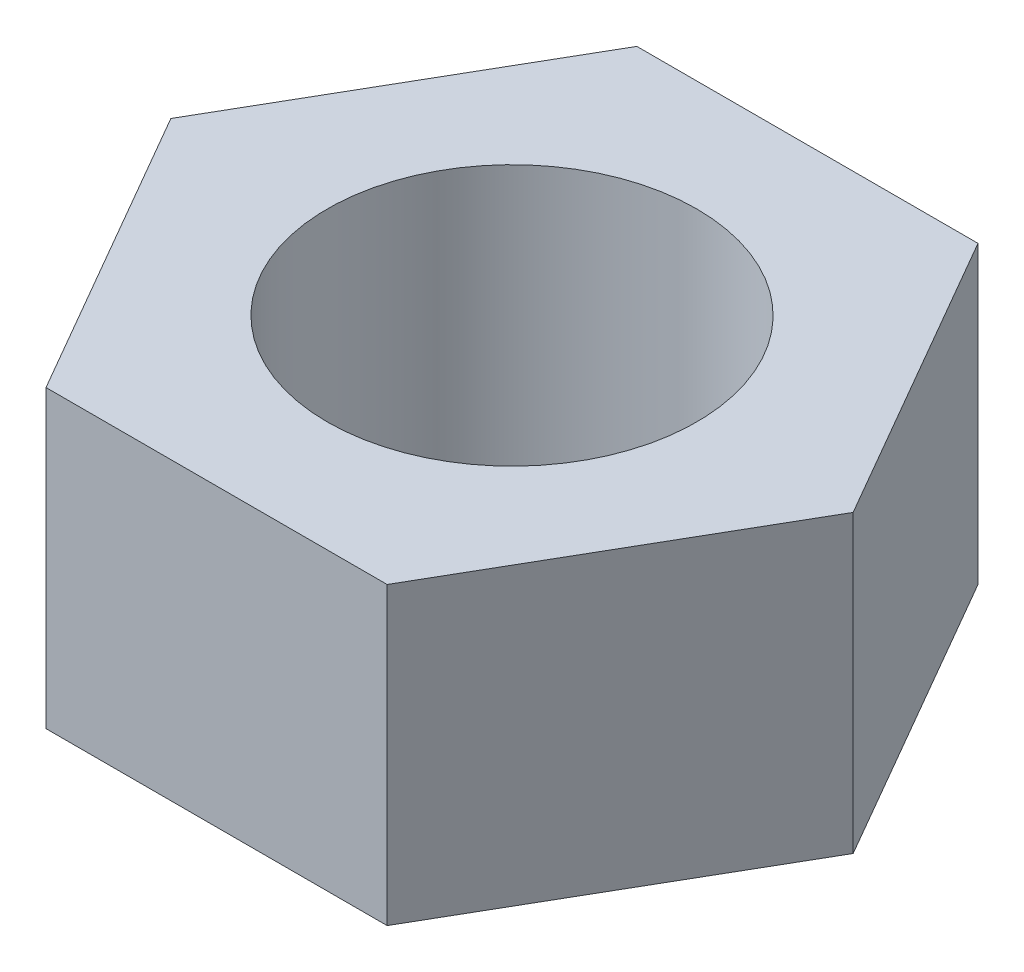
ISO-10303-21;
HEADER;
FILE_DESCRIPTION(('STEP AP214'),'2;1');
FILE_NAME('part.step','',(''),(''),'','','');
FILE_SCHEMA(('AUTOMOTIVE_DESIGN { 1 0 10303 214 1 1 1 1 }'));
ENDSEC;
DATA;
#1=APPLICATION_CONTEXT('core data for automotive mechanical design processes');
#2=APPLICATION_PROTOCOL_DEFINITION('international standard','automotive_design',2000,#1);
#3=PRODUCT_CONTEXT('',#1,'mechanical');
#4=PRODUCT('Part','Part','',(#3));
#5=PRODUCT_RELATED_PRODUCT_CATEGORY('part','',(#4));
#6=PRODUCT_DEFINITION_FORMATION('','',#4);
#7=PRODUCT_DEFINITION_CONTEXT('part definition',#1,'design');
#8=PRODUCT_DEFINITION('design','',#6,#7);
#9=PRODUCT_DEFINITION_SHAPE('','',#8);
#10=(LENGTH_UNIT() NAMED_UNIT(*) SI_UNIT(.MILLI.,.METRE.));
#11=(NAMED_UNIT(*) PLANE_ANGLE_UNIT() SI_UNIT($,.RADIAN.));
#12=(NAMED_UNIT(*) SI_UNIT($,.STERADIAN.) SOLID_ANGLE_UNIT());
#13=UNCERTAINTY_MEASURE_WITH_UNIT(LENGTH_MEASURE(1.E-05),#10,'distance_accuracy_value','');
#14=(GEOMETRIC_REPRESENTATION_CONTEXT(3) GLOBAL_UNCERTAINTY_ASSIGNED_CONTEXT((#13)) GLOBAL_UNIT_ASSIGNED_CONTEXT((#10,
#11,#12)) REPRESENTATION_CONTEXT('',''));
#15=CARTESIAN_POINT('',(0.,0.,0.));
#16=DIRECTION('',(0.,0.,1.));
#17=DIRECTION('',(1.,0.,0.));
#18=AXIS2_PLACEMENT_3D('',#15,#16,#17);
#19=CARTESIAN_POINT('',(0.,4.,0.));
#20=DIRECTION('',(0.,-1.,0.));
#21=DIRECTION('',(0.,0.,-1.));
#22=AXIS2_PLACEMENT_3D('',#19,#20,#21);
#23=PLANE('',#22);
#24=DIRECTION('',(-0.500000000000003,0.,0.866025403784437));
#25=VECTOR('',#24,1.);
#26=CARTESIAN_POINT('',(-2.3094010767585,4.,-4.));
#27=LINE('',#26,#25);
#28=CARTESIAN_POINT('',(-2.3094010767585,4.,-4.));
#29=VERTEX_POINT('',#28);
#30=CARTESIAN_POINT('',(-4.618802153517,4.,0.));
#31=VERTEX_POINT('',#30);
#32=EDGE_CURVE('E150',#29,#31,#27,.T.);
#33=ORIENTED_EDGE('',*,*,#32,.T.);
#34=DIRECTION('',(0.499999999999996,0.,0.866025403784441));
#35=VECTOR('',#34,1.);
#36=CARTESIAN_POINT('',(-2.3094010767585,4.,4.));
#37=LINE('',#36,#35);
#38=CARTESIAN_POINT('',(-2.3094010767585,4.,4.));
#39=VERTEX_POINT('',#38);
#40=EDGE_CURVE('E98',#31,#39,#37,.T.);
#41=ORIENTED_EDGE('',*,*,#40,.T.);
#42=DIRECTION('',(1.,0.,0.));
#43=VECTOR('',#42,1.);
#44=CARTESIAN_POINT('',(-2.3094010767585,4.,4.));
#45=LINE('',#44,#43);
#46=CARTESIAN_POINT('',(2.30940107675851,4.,4.));
#47=VERTEX_POINT('',#46);
#48=EDGE_CURVE('E111',#39,#47,#45,.T.);
#49=ORIENTED_EDGE('',*,*,#48,.T.);
#50=DIRECTION('',(0.500000000000001,0.,-0.866025403784438));
#51=VECTOR('',#50,1.);
#52=CARTESIAN_POINT('',(4.61880215351701,4.,0.));
#53=LINE('',#52,#51);
#54=CARTESIAN_POINT('',(4.61880215351701,4.,0.));
#55=VERTEX_POINT('',#54);
#56=EDGE_CURVE('E105',#47,#55,#53,.T.);
#57=ORIENTED_EDGE('',*,*,#56,.T.);
#58=DIRECTION('',(-0.500000000000001,0.,-0.866025403784438));
#59=VECTOR('',#58,1.);
#60=CARTESIAN_POINT('',(4.61880215351701,4.,0.));
#61=LINE('',#60,#59);
#62=CARTESIAN_POINT('',(2.30940107675851,4.,-4.));
#63=VERTEX_POINT('',#62);
#64=EDGE_CURVE('E109',#55,#63,#61,.T.);
#65=ORIENTED_EDGE('',*,*,#64,.T.);
#66=DIRECTION('',(-1.,0.,0.));
#67=VECTOR('',#66,1.);
#68=CARTESIAN_POINT('',(-2.3094010767585,4.,-4.));
#69=LINE('',#68,#67);
#70=EDGE_CURVE('E61',#63,#29,#69,.T.);
#71=ORIENTED_EDGE('',*,*,#70,.T.);
#72=EDGE_LOOP('',(#33,#41,#49,#57,#65,#71));
#73=FACE_BOUND('',#72,.T.);
#74=CARTESIAN_POINT('',(0.,4.,0.));
#75=DIRECTION('',(0.,1.,0.));
#76=DIRECTION('',(0.,0.,1.));
#77=AXIS2_PLACEMENT_3D('',#74,#75,#76);
#78=CIRCLE('',#77,2.5);
#79=CARTESIAN_POINT('',(0.,4.,2.50000000000001));
#80=VERTEX_POINT('',#79);
#81=EDGE_CURVE('E138',#80,#80,#78,.T.);
#82=ORIENTED_EDGE('',*,*,#81,.F.);
#83=EDGE_LOOP('',(#82));
#84=FACE_BOUND('',#83,.T.);
#85=ADVANCED_FACE('F43',(#73,#84),#23,.F.);
#86=CARTESIAN_POINT('',(0.,0.,0.));
#87=DIRECTION('',(0.,-1.,0.));
#88=DIRECTION('',(0.,0.,-1.));
#89=AXIS2_PLACEMENT_3D('',#86,#87,#88);
#90=PLANE('',#89);
#91=DIRECTION('',(-0.500000000000003,0.,0.866025403784437));
#92=VECTOR('',#91,1.);
#93=CARTESIAN_POINT('',(-2.3094010767585,0.,-4.));
#94=LINE('',#93,#92);
#95=CARTESIAN_POINT('',(-2.3094010767585,0.,-4.));
#96=VERTEX_POINT('',#95);
#97=CARTESIAN_POINT('',(-4.618802153517,0.,0.));
#98=VERTEX_POINT('',#97);
#99=EDGE_CURVE('E133',#96,#98,#94,.T.);
#100=ORIENTED_EDGE('',*,*,#99,.F.);
#101=DIRECTION('',(-1.,0.,0.));
#102=VECTOR('',#101,1.);
#103=CARTESIAN_POINT('',(-2.3094010767585,0.,-4.));
#104=LINE('',#103,#102);
#105=CARTESIAN_POINT('',(2.30940107675851,0.,-4.));
#106=VERTEX_POINT('',#105);
#107=EDGE_CURVE('E90',#106,#96,#104,.T.);
#108=ORIENTED_EDGE('',*,*,#107,.F.);
#109=DIRECTION('',(-0.500000000000001,0.,-0.866025403784438));
#110=VECTOR('',#109,1.);
#111=CARTESIAN_POINT('',(4.61880215351701,0.,0.));
#112=LINE('',#111,#110);
#113=CARTESIAN_POINT('',(4.61880215351701,0.,0.));
#114=VERTEX_POINT('',#113);
#115=EDGE_CURVE('E84',#114,#106,#112,.T.);
#116=ORIENTED_EDGE('',*,*,#115,.F.);
#117=DIRECTION('',(0.500000000000001,0.,-0.866025403784438));
#118=VECTOR('',#117,1.);
#119=CARTESIAN_POINT('',(4.61880215351701,0.,0.));
#120=LINE('',#119,#118);
#121=CARTESIAN_POINT('',(2.30940107675851,0.,4.));
#122=VERTEX_POINT('',#121);
#123=EDGE_CURVE('E120',#122,#114,#120,.T.);
#124=ORIENTED_EDGE('',*,*,#123,.F.);
#125=DIRECTION('',(1.,0.,0.));
#126=VECTOR('',#125,1.);
#127=CARTESIAN_POINT('',(-2.3094010767585,0.,4.));
#128=LINE('',#127,#126);
#129=CARTESIAN_POINT('',(-2.3094010767585,0.,4.));
#130=VERTEX_POINT('',#129);
#131=EDGE_CURVE('E141',#130,#122,#128,.T.);
#132=ORIENTED_EDGE('',*,*,#131,.F.);
#133=DIRECTION('',(0.499999999999996,0.,0.866025403784441));
#134=VECTOR('',#133,1.);
#135=CARTESIAN_POINT('',(-2.3094010767585,0.,4.));
#136=LINE('',#135,#134);
#137=EDGE_CURVE('E137',#98,#130,#136,.T.);
#138=ORIENTED_EDGE('',*,*,#137,.F.);
#139=EDGE_LOOP('',(#100,#108,#116,#124,#132,#138));
#140=FACE_BOUND('',#139,.T.);
#141=CARTESIAN_POINT('',(0.,0.,0.));
#142=DIRECTION('',(0.,1.,0.));
#143=DIRECTION('',(0.,0.,1.));
#144=AXIS2_PLACEMENT_3D('',#141,#142,#143);
#145=CIRCLE('',#144,2.5);
#146=CARTESIAN_POINT('',(0.,0.,2.50000000000001));
#147=VERTEX_POINT('',#146);
#148=EDGE_CURVE('E265',#147,#147,#145,.T.);
#149=ORIENTED_EDGE('',*,*,#148,.T.);
#150=EDGE_LOOP('',(#149));
#151=FACE_BOUND('',#150,.T.);
#152=ADVANCED_FACE('F163',(#140,#151),#90,.T.);
#153=CARTESIAN_POINT('',(-2.3094010767585,4.,-4.));
#154=DIRECTION('',(0.866025403784437,0.,0.500000000000003));
#155=DIRECTION('',(0.500000000000003,0.,-0.866025403784437));
#156=AXIS2_PLACEMENT_3D('',#153,#154,#155);
#157=PLANE('',#156);
#158=ORIENTED_EDGE('',*,*,#99,.T.);
#159=DIRECTION('',(0.,-1.,0.));
#160=VECTOR('',#159,1.);
#161=CARTESIAN_POINT('',(-4.618802153517,4.,0.));
#162=LINE('',#161,#160);
#163=EDGE_CURVE('E11',#31,#98,#162,.T.);
#164=ORIENTED_EDGE('',*,*,#163,.F.);
#165=ORIENTED_EDGE('',*,*,#32,.F.);
#166=DIRECTION('',(0.,-1.,0.));
#167=VECTOR('',#166,1.);
#168=CARTESIAN_POINT('',(-2.3094010767585,4.,-4.));
#169=LINE('',#168,#167);
#170=EDGE_CURVE('E129',#29,#96,#169,.T.);
#171=ORIENTED_EDGE('',*,*,#170,.T.);
#172=EDGE_LOOP('',(#158,#164,#165,#171));
#173=FACE_BOUND('',#172,.T.);
#174=ADVANCED_FACE('F45',(#173),#157,.F.);
#175=CARTESIAN_POINT('',(-2.3094010767585,4.,4.));
#176=DIRECTION('',(0.866025403784441,0.,-0.499999999999996));
#177=DIRECTION('',(-0.499999999999996,0.,-0.866025403784441));
#178=AXIS2_PLACEMENT_3D('',#175,#176,#177);
#179=PLANE('',#178);
#180=ORIENTED_EDGE('',*,*,#137,.T.);
#181=DIRECTION('',(0.,-1.,0.));
#182=VECTOR('',#181,1.);
#183=CARTESIAN_POINT('',(-2.3094010767585,4.,4.));
#184=LINE('',#183,#182);
#185=EDGE_CURVE('E53',#39,#130,#184,.T.);
#186=ORIENTED_EDGE('',*,*,#185,.F.);
#187=ORIENTED_EDGE('',*,*,#40,.F.);
#188=ORIENTED_EDGE('',*,*,#163,.T.);
#189=EDGE_LOOP('',(#180,#186,#187,#188));
#190=FACE_BOUND('',#189,.T.);
#191=ADVANCED_FACE('F188',(#190),#179,.F.);
#192=CARTESIAN_POINT('',(-2.3094010767585,4.,4.));
#193=DIRECTION('',(0.,0.,-1.));
#194=DIRECTION('',(-1.,0.,0.));
#195=AXIS2_PLACEMENT_3D('',#192,#193,#194);
#196=PLANE('',#195);
#197=ORIENTED_EDGE('',*,*,#131,.T.);
#198=DIRECTION('',(0.,-1.,0.));
#199=VECTOR('',#198,1.);
#200=CARTESIAN_POINT('',(2.30940107675851,4.,4.));
#201=LINE('',#200,#199);
#202=EDGE_CURVE('E122',#47,#122,#201,.T.);
#203=ORIENTED_EDGE('',*,*,#202,.F.);
#204=ORIENTED_EDGE('',*,*,#48,.F.);
#205=ORIENTED_EDGE('',*,*,#185,.T.);
#206=EDGE_LOOP('',(#197,#203,#204,#205));
#207=FACE_BOUND('',#206,.T.);
#208=ADVANCED_FACE('F160',(#207),#196,.F.);
#209=CARTESIAN_POINT('',(4.61880215351701,4.,0.));
#210=DIRECTION('',(-0.866025403784438,0.,-0.500000000000001));
#211=DIRECTION('',(-0.500000000000001,0.,0.866025403784438));
#212=AXIS2_PLACEMENT_3D('',#209,#210,#211);
#213=PLANE('',#212);
#214=ORIENTED_EDGE('',*,*,#123,.T.);
#215=DIRECTION('',(0.,-1.,0.));
#216=VECTOR('',#215,1.);
#217=CARTESIAN_POINT('',(4.61880215351701,4.,0.));
#218=LINE('',#217,#216);
#219=EDGE_CURVE('E117',#55,#114,#218,.T.);
#220=ORIENTED_EDGE('',*,*,#219,.F.);
#221=ORIENTED_EDGE('',*,*,#56,.F.);
#222=ORIENTED_EDGE('',*,*,#202,.T.);
#223=EDGE_LOOP('',(#214,#220,#221,#222));
#224=FACE_BOUND('',#223,.T.);
#225=ADVANCED_FACE('F118',(#224),#213,.F.);
#226=CARTESIAN_POINT('',(4.61880215351701,4.,0.));
#227=DIRECTION('',(-0.866025403784438,0.,0.500000000000001));
#228=DIRECTION('',(0.500000000000001,0.,0.866025403784438));
#229=AXIS2_PLACEMENT_3D('',#226,#227,#228);
#230=PLANE('',#229);
#231=ORIENTED_EDGE('',*,*,#115,.T.);
#232=DIRECTION('',(0.,-1.,0.));
#233=VECTOR('',#232,1.);
#234=CARTESIAN_POINT('',(2.30940107675851,4.,-4.));
#235=LINE('',#234,#233);
#236=EDGE_CURVE('E123',#63,#106,#235,.T.);
#237=ORIENTED_EDGE('',*,*,#236,.F.);
#238=ORIENTED_EDGE('',*,*,#64,.F.);
#239=ORIENTED_EDGE('',*,*,#219,.T.);
#240=EDGE_LOOP('',(#231,#237,#238,#239));
#241=FACE_BOUND('',#240,.T.);
#242=ADVANCED_FACE('F125',(#241),#230,.F.);
#243=CARTESIAN_POINT('',(-2.3094010767585,4.,-4.));
#244=DIRECTION('',(0.,0.,1.));
#245=DIRECTION('',(1.,0.,0.));
#246=AXIS2_PLACEMENT_3D('',#243,#244,#245);
#247=PLANE('',#246);
#248=ORIENTED_EDGE('',*,*,#107,.T.);
#249=ORIENTED_EDGE('',*,*,#170,.F.);
#250=ORIENTED_EDGE('',*,*,#70,.F.);
#251=ORIENTED_EDGE('',*,*,#236,.T.);
#252=EDGE_LOOP('',(#248,#249,#250,#251));
#253=FACE_BOUND('',#252,.T.);
#254=ADVANCED_FACE('F168',(#253),#247,.F.);
#255=CARTESIAN_POINT('',(0.,4.,0.));
#256=DIRECTION('',(0.,-1.,0.));
#257=DIRECTION('',(0.,0.,-1.));
#258=AXIS2_PLACEMENT_3D('',#255,#256,#257);
#259=CYLINDRICAL_SURFACE('',#258,2.5);
#260=ORIENTED_EDGE('',*,*,#81,.T.);
#261=EDGE_LOOP('',(#260));
#262=FACE_BOUND('',#261,.T.);
#263=ORIENTED_EDGE('',*,*,#148,.F.);
#264=EDGE_LOOP('',(#263));
#265=FACE_BOUND('',#264,.T.);
#266=ADVANCED_FACE('F170',(#262,#265),#259,.F.);
#267=CLOSED_SHELL('',(#85,#152,#174,#191,#208,#225,#242,#254,#266));
#268=MANIFOLD_SOLID_BREP('B2',#267);
#269=ADVANCED_BREP_SHAPE_REPRESENTATION('',(#18,#268),#14);
#270=SHAPE_DEFINITION_REPRESENTATION(#9,#269);
ENDSEC;
END-ISO-10303-21;
